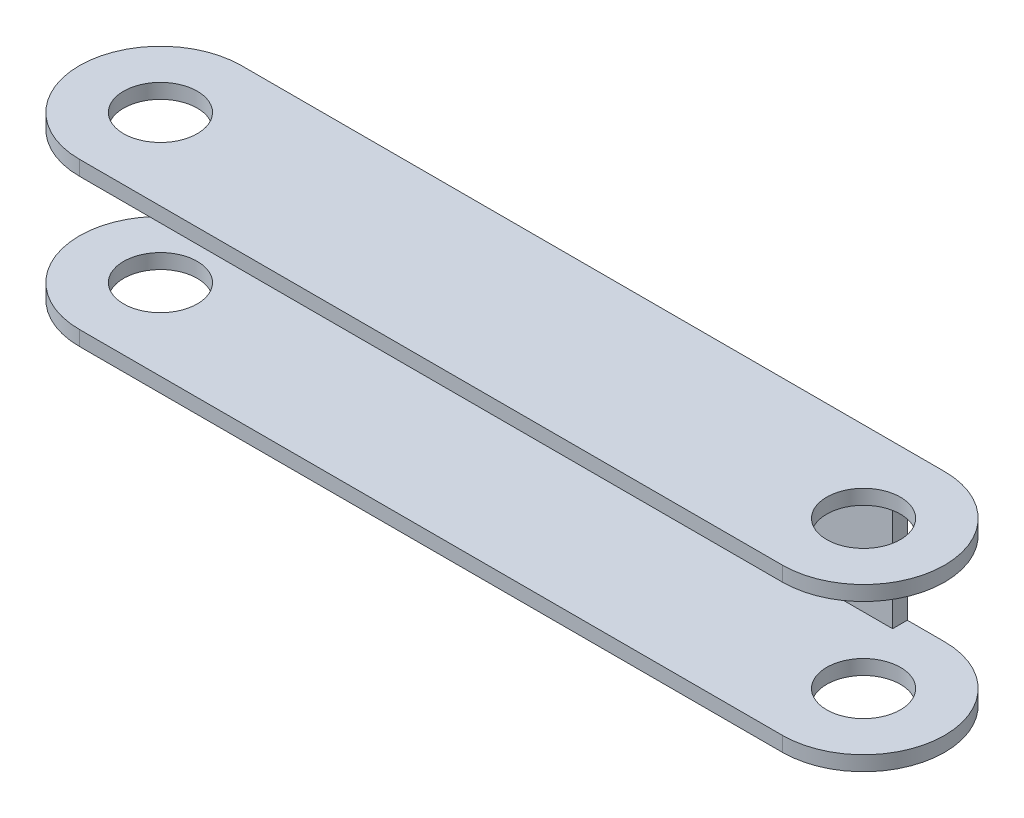
ISO-10303-21;
HEADER;
FILE_DESCRIPTION(('STEP AP214'),'2;1');
FILE_NAME('part.step','',(''),(''),'','','');
FILE_SCHEMA(('AUTOMOTIVE_DESIGN { 1 0 10303 214 1 1 1 1 }'));
ENDSEC;
DATA;
#1=APPLICATION_CONTEXT('core data for automotive mechanical design processes');
#2=APPLICATION_PROTOCOL_DEFINITION('international standard','automotive_design',2000,#1);
#3=PRODUCT_CONTEXT('',#1,'mechanical');
#4=PRODUCT('Part','Part','',(#3));
#5=PRODUCT_RELATED_PRODUCT_CATEGORY('part','',(#4));
#6=PRODUCT_DEFINITION_FORMATION('','',#4);
#7=PRODUCT_DEFINITION_CONTEXT('part definition',#1,'design');
#8=PRODUCT_DEFINITION('design','',#6,#7);
#9=PRODUCT_DEFINITION_SHAPE('','',#8);
#10=(LENGTH_UNIT() NAMED_UNIT(*) SI_UNIT(.MILLI.,.METRE.));
#11=(NAMED_UNIT(*) PLANE_ANGLE_UNIT() SI_UNIT($,.RADIAN.));
#12=(NAMED_UNIT(*) SI_UNIT($,.STERADIAN.) SOLID_ANGLE_UNIT());
#13=UNCERTAINTY_MEASURE_WITH_UNIT(LENGTH_MEASURE(1.E-05),#10,'distance_accuracy_value','');
#14=(GEOMETRIC_REPRESENTATION_CONTEXT(3) GLOBAL_UNCERTAINTY_ASSIGNED_CONTEXT((#13)) GLOBAL_UNIT_ASSIGNED_CONTEXT((#10,
#11,#12)) REPRESENTATION_CONTEXT('',''));
#15=CARTESIAN_POINT('',(0.,0.,0.));
#16=DIRECTION('',(0.,0.,1.));
#17=DIRECTION('',(1.,0.,0.));
#18=AXIS2_PLACEMENT_3D('',#15,#16,#17);
#19=CARTESIAN_POINT('',(-47.7,2.,0.));
#20=DIRECTION('',(0.,1.,0.));
#21=DIRECTION('',(0.,0.,1.));
#22=AXIS2_PLACEMENT_3D('',#19,#20,#21);
#23=PLANE('',#22);
#24=DIRECTION('',(0.,0.,1.));
#25=VECTOR('',#24,1.);
#26=CARTESIAN_POINT('',(-37.3590795102385,2.,-11.));
#27=LINE('',#26,#25);
#28=CARTESIAN_POINT('',(-37.3590795102385,2.,-11.));
#29=VERTEX_POINT('',#28);
#30=CARTESIAN_POINT('',(-37.3590795102385,2.,-9.00000000000001));
#31=VERTEX_POINT('',#30);
#32=EDGE_CURVE('E61',#29,#31,#27,.T.);
#33=ORIENTED_EDGE('',*,*,#32,.F.);
#34=DIRECTION('',(-1.,0.,0.));
#35=VECTOR('',#34,1.);
#36=CARTESIAN_POINT('',(-47.7,2.,-11.));
#37=LINE('',#36,#35);
#38=CARTESIAN_POINT('',(-47.7,2.,-11.));
#39=VERTEX_POINT('',#38);
#40=EDGE_CURVE('E230',#29,#39,#37,.T.);
#41=ORIENTED_EDGE('',*,*,#40,.T.);
#42=CARTESIAN_POINT('',(-47.7,2.,0.));
#43=DIRECTION('',(0.,1.,0.));
#44=DIRECTION('',(0.,0.,1.));
#45=AXIS2_PLACEMENT_3D('',#42,#43,#44);
#46=CIRCLE('',#45,11.);
#47=CARTESIAN_POINT('',(-47.7,2.,11.));
#48=VERTEX_POINT('',#47);
#49=EDGE_CURVE('E222',#39,#48,#46,.T.);
#50=ORIENTED_EDGE('',*,*,#49,.T.);
#51=DIRECTION('',(1.,0.,0.));
#52=VECTOR('',#51,1.);
#53=CARTESIAN_POINT('',(-47.7,2.,11.));
#54=LINE('',#53,#52);
#55=CARTESIAN_POINT('',(47.7,2.,11.));
#56=VERTEX_POINT('',#55);
#57=EDGE_CURVE('E225',#48,#56,#54,.T.);
#58=ORIENTED_EDGE('',*,*,#57,.T.);
#59=CARTESIAN_POINT('',(47.7,2.,0.));
#60=DIRECTION('',(0.,1.,0.));
#61=DIRECTION('',(0.,0.,1.));
#62=AXIS2_PLACEMENT_3D('',#59,#60,#61);
#63=CIRCLE('',#62,11.);
#64=CARTESIAN_POINT('',(47.7,2.,-11.));
#65=VERTEX_POINT('',#64);
#66=EDGE_CURVE('E228',#56,#65,#63,.T.);
#67=ORIENTED_EDGE('',*,*,#66,.T.);
#68=CARTESIAN_POINT('',(42.6409204897615,2.,-11.));
#69=VERTEX_POINT('',#68);
#70=EDGE_CURVE('E231',#65,#69,#37,.T.);
#71=ORIENTED_EDGE('',*,*,#70,.T.);
#72=DIRECTION('',(0.,0.,-1.));
#73=VECTOR('',#72,1.);
#74=CARTESIAN_POINT('',(42.6409204897615,2.,-11.));
#75=LINE('',#74,#73);
#76=CARTESIAN_POINT('',(42.6409204897615,2.,-9.00000000000001));
#77=VERTEX_POINT('',#76);
#78=EDGE_CURVE('E202',#77,#69,#75,.T.);
#79=ORIENTED_EDGE('',*,*,#78,.F.);
#80=DIRECTION('',(1.,0.,0.));
#81=VECTOR('',#80,1.);
#82=CARTESIAN_POINT('',(-37.3590795102385,2.,-9.00000000000001));
#83=LINE('',#82,#81);
#84=EDGE_CURVE('E56',#31,#77,#83,.T.);
#85=ORIENTED_EDGE('',*,*,#84,.F.);
#86=EDGE_LOOP('',(#33,#41,#50,#58,#67,#71,#79,#85));
#87=FACE_BOUND('',#86,.T.);
#88=CARTESIAN_POINT('',(47.7,2.,0.));
#89=DIRECTION('',(0.,1.,0.));
#90=DIRECTION('',(0.,0.,1.));
#91=AXIS2_PLACEMENT_3D('',#88,#89,#90);
#92=CIRCLE('',#91,5.);
#93=CARTESIAN_POINT('',(47.7,2.,4.99999999999999));
#94=VERTEX_POINT('',#93);
#95=EDGE_CURVE('E216',#94,#94,#92,.T.);
#96=ORIENTED_EDGE('',*,*,#95,.F.);
#97=EDGE_LOOP('',(#96));
#98=FACE_BOUND('',#97,.T.);
#99=CARTESIAN_POINT('',(-47.7,2.,0.));
#100=DIRECTION('',(0.,1.,0.));
#101=DIRECTION('',(0.,0.,1.));
#102=AXIS2_PLACEMENT_3D('',#99,#100,#101);
#103=CIRCLE('',#102,5.);
#104=CARTESIAN_POINT('',(-47.7,2.,5.00000000000002));
#105=VERTEX_POINT('',#104);
#106=EDGE_CURVE('E210',#105,#105,#103,.T.);
#107=ORIENTED_EDGE('',*,*,#106,.F.);
#108=EDGE_LOOP('',(#107));
#109=FACE_BOUND('',#108,.T.);
#110=ADVANCED_FACE('F41',(#87,#98,#109),#23,.T.);
#111=CARTESIAN_POINT('',(-47.7,0.,0.));
#112=DIRECTION('',(0.,1.,0.));
#113=DIRECTION('',(0.,0.,1.));
#114=AXIS2_PLACEMENT_3D('',#111,#112,#113);
#115=PLANE('',#114);
#116=CARTESIAN_POINT('',(-47.7,0.,0.));
#117=DIRECTION('',(0.,1.,0.));
#118=DIRECTION('',(0.,0.,1.));
#119=AXIS2_PLACEMENT_3D('',#116,#117,#118);
#120=CIRCLE('',#119,11.);
#121=CARTESIAN_POINT('',(-47.7,0.,-11.));
#122=VERTEX_POINT('',#121);
#123=CARTESIAN_POINT('',(-47.7,0.,11.));
#124=VERTEX_POINT('',#123);
#125=EDGE_CURVE('E219',#122,#124,#120,.T.);
#126=ORIENTED_EDGE('',*,*,#125,.F.);
#127=DIRECTION('',(-1.,0.,0.));
#128=VECTOR('',#127,1.);
#129=CARTESIAN_POINT('',(-47.7,0.,-11.));
#130=LINE('',#129,#128);
#131=CARTESIAN_POINT('',(47.7,0.,-11.));
#132=VERTEX_POINT('',#131);
#133=EDGE_CURVE('E226',#132,#122,#130,.T.);
#134=ORIENTED_EDGE('',*,*,#133,.F.);
#135=CARTESIAN_POINT('',(47.7,0.,0.));
#136=DIRECTION('',(0.,1.,0.));
#137=DIRECTION('',(0.,0.,1.));
#138=AXIS2_PLACEMENT_3D('',#135,#136,#137);
#139=CIRCLE('',#138,11.);
#140=CARTESIAN_POINT('',(47.7,0.,11.));
#141=VERTEX_POINT('',#140);
#142=EDGE_CURVE('E238',#141,#132,#139,.T.);
#143=ORIENTED_EDGE('',*,*,#142,.F.);
#144=DIRECTION('',(1.,0.,0.));
#145=VECTOR('',#144,1.);
#146=CARTESIAN_POINT('',(-47.7,0.,11.));
#147=LINE('',#146,#145);
#148=EDGE_CURVE('E236',#124,#141,#147,.T.);
#149=ORIENTED_EDGE('',*,*,#148,.F.);
#150=EDGE_LOOP('',(#126,#134,#143,#149));
#151=FACE_BOUND('',#150,.T.);
#152=CARTESIAN_POINT('',(47.7,0.,0.));
#153=DIRECTION('',(0.,1.,0.));
#154=DIRECTION('',(0.,0.,1.));
#155=AXIS2_PLACEMENT_3D('',#152,#153,#154);
#156=CIRCLE('',#155,5.);
#157=CARTESIAN_POINT('',(47.7,0.,4.99999999999999));
#158=VERTEX_POINT('',#157);
#159=EDGE_CURVE('E213',#158,#158,#156,.T.);
#160=ORIENTED_EDGE('',*,*,#159,.T.);
#161=EDGE_LOOP('',(#160));
#162=FACE_BOUND('',#161,.T.);
#163=CARTESIAN_POINT('',(-47.7,0.,0.));
#164=DIRECTION('',(0.,1.,0.));
#165=DIRECTION('',(0.,0.,1.));
#166=AXIS2_PLACEMENT_3D('',#163,#164,#165);
#167=CIRCLE('',#166,5.);
#168=CARTESIAN_POINT('',(-47.7,0.,5.00000000000002));
#169=VERTEX_POINT('',#168);
#170=EDGE_CURVE('E209',#169,#169,#167,.T.);
#171=ORIENTED_EDGE('',*,*,#170,.T.);
#172=EDGE_LOOP('',(#171));
#173=FACE_BOUND('',#172,.T.);
#174=ADVANCED_FACE('F256',(#151,#162,#173),#115,.F.);
#175=CARTESIAN_POINT('',(-47.7,2.,0.));
#176=DIRECTION('',(0.,-1.,0.));
#177=DIRECTION('',(0.,0.,-1.));
#178=AXIS2_PLACEMENT_3D('',#175,#176,#177);
#179=CYLINDRICAL_SURFACE('',#178,11.);
#180=ORIENTED_EDGE('',*,*,#125,.T.);
#181=DIRECTION('',(0.,-1.,0.));
#182=VECTOR('',#181,1.);
#183=CARTESIAN_POINT('',(-47.7,2.,11.));
#184=LINE('',#183,#182);
#185=EDGE_CURVE('E11',#48,#124,#184,.T.);
#186=ORIENTED_EDGE('',*,*,#185,.F.);
#187=ORIENTED_EDGE('',*,*,#49,.F.);
#188=DIRECTION('',(0.,-1.,0.));
#189=VECTOR('',#188,1.);
#190=CARTESIAN_POINT('',(-47.7,2.,-11.));
#191=LINE('',#190,#189);
#192=EDGE_CURVE('E233',#39,#122,#191,.T.);
#193=ORIENTED_EDGE('',*,*,#192,.T.);
#194=EDGE_LOOP('',(#180,#186,#187,#193));
#195=FACE_BOUND('',#194,.T.);
#196=ADVANCED_FACE('F43',(#195),#179,.T.);
#197=CARTESIAN_POINT('',(-47.7,2.,11.));
#198=DIRECTION('',(0.,0.,-1.));
#199=DIRECTION('',(-1.,0.,0.));
#200=AXIS2_PLACEMENT_3D('',#197,#198,#199);
#201=PLANE('',#200);
#202=ORIENTED_EDGE('',*,*,#148,.T.);
#203=DIRECTION('',(0.,-1.,0.));
#204=VECTOR('',#203,1.);
#205=CARTESIAN_POINT('',(47.7,2.,11.));
#206=LINE('',#205,#204);
#207=EDGE_CURVE('E49',#56,#141,#206,.T.);
#208=ORIENTED_EDGE('',*,*,#207,.F.);
#209=ORIENTED_EDGE('',*,*,#57,.F.);
#210=ORIENTED_EDGE('',*,*,#185,.T.);
#211=EDGE_LOOP('',(#202,#208,#209,#210));
#212=FACE_BOUND('',#211,.T.);
#213=ADVANCED_FACE('F292',(#212),#201,.F.);
#214=CARTESIAN_POINT('',(47.7,2.,0.));
#215=DIRECTION('',(0.,-1.,0.));
#216=DIRECTION('',(0.,0.,-1.));
#217=AXIS2_PLACEMENT_3D('',#214,#215,#216);
#218=CYLINDRICAL_SURFACE('',#217,11.);
#219=ORIENTED_EDGE('',*,*,#142,.T.);
#220=DIRECTION('',(0.,-1.,0.));
#221=VECTOR('',#220,1.);
#222=CARTESIAN_POINT('',(47.7,2.,-11.));
#223=LINE('',#222,#221);
#224=EDGE_CURVE('E243',#65,#132,#223,.T.);
#225=ORIENTED_EDGE('',*,*,#224,.F.);
#226=ORIENTED_EDGE('',*,*,#66,.F.);
#227=ORIENTED_EDGE('',*,*,#207,.T.);
#228=EDGE_LOOP('',(#219,#225,#226,#227));
#229=FACE_BOUND('',#228,.T.);
#230=ADVANCED_FACE('F250',(#229),#218,.T.);
#231=CARTESIAN_POINT('',(-47.7,2.,-11.));
#232=DIRECTION('',(0.,0.,1.));
#233=DIRECTION('',(1.,0.,0.));
#234=AXIS2_PLACEMENT_3D('',#231,#232,#233);
#235=PLANE('',#234);
#236=ORIENTED_EDGE('',*,*,#133,.T.);
#237=ORIENTED_EDGE('',*,*,#192,.F.);
#238=ORIENTED_EDGE('',*,*,#40,.F.);
#239=DIRECTION('',(0.,-1.,0.));
#240=VECTOR('',#239,1.);
#241=CARTESIAN_POINT('',(-37.3590795102385,11.,-11.));
#242=LINE('',#241,#240);
#243=CARTESIAN_POINT('',(-37.3590795102385,20.,-11.));
#244=VERTEX_POINT('',#243);
#245=EDGE_CURVE('E204',#244,#29,#242,.T.);
#246=ORIENTED_EDGE('',*,*,#245,.F.);
#247=DIRECTION('',(-1.,0.,0.));
#248=VECTOR('',#247,1.);
#249=CARTESIAN_POINT('',(-47.7,20.,-11.));
#250=LINE('',#249,#248);
#251=CARTESIAN_POINT('',(-47.7,20.,-11.));
#252=VERTEX_POINT('',#251);
#253=EDGE_CURVE('E179',#244,#252,#250,.T.);
#254=ORIENTED_EDGE('',*,*,#253,.T.);
#255=DIRECTION('',(0.,1.,0.));
#256=VECTOR('',#255,1.);
#257=CARTESIAN_POINT('',(-47.7,20.,-11.));
#258=LINE('',#257,#256);
#259=CARTESIAN_POINT('',(-47.7,22.,-11.));
#260=VERTEX_POINT('',#259);
#261=EDGE_CURVE('E182',#252,#260,#258,.T.);
#262=ORIENTED_EDGE('',*,*,#261,.T.);
#263=DIRECTION('',(-1.,0.,0.));
#264=VECTOR('',#263,1.);
#265=CARTESIAN_POINT('',(-47.7,22.,-11.));
#266=LINE('',#265,#264);
#267=CARTESIAN_POINT('',(47.7,22.,-11.));
#268=VERTEX_POINT('',#267);
#269=EDGE_CURVE('E173',#268,#260,#266,.T.);
#270=ORIENTED_EDGE('',*,*,#269,.F.);
#271=DIRECTION('',(0.,1.,0.));
#272=VECTOR('',#271,1.);
#273=CARTESIAN_POINT('',(47.7,20.,-11.));
#274=LINE('',#273,#272);
#275=CARTESIAN_POINT('',(47.7,20.,-11.));
#276=VERTEX_POINT('',#275);
#277=EDGE_CURVE('E194',#276,#268,#274,.T.);
#278=ORIENTED_EDGE('',*,*,#277,.F.);
#279=CARTESIAN_POINT('',(42.6409204897615,20.,-11.));
#280=VERTEX_POINT('',#279);
#281=EDGE_CURVE('E180',#276,#280,#250,.T.);
#282=ORIENTED_EDGE('',*,*,#281,.T.);
#283=DIRECTION('',(0.,-1.,0.));
#284=VECTOR('',#283,1.);
#285=CARTESIAN_POINT('',(42.6409204897615,11.,-11.));
#286=LINE('',#285,#284);
#287=EDGE_CURVE('E138',#280,#69,#286,.T.);
#288=ORIENTED_EDGE('',*,*,#287,.T.);
#289=ORIENTED_EDGE('',*,*,#70,.F.);
#290=ORIENTED_EDGE('',*,*,#224,.T.);
#291=EDGE_LOOP('',(#236,#237,#238,#246,#254,#262,#270,#278,#282,#288,#289,#290));
#292=FACE_BOUND('',#291,.T.);
#293=ADVANCED_FACE('F260',(#292),#235,.F.);
#294=CARTESIAN_POINT('',(47.7,2.,0.));
#295=DIRECTION('',(0.,-1.,0.));
#296=DIRECTION('',(0.,0.,-1.));
#297=AXIS2_PLACEMENT_3D('',#294,#295,#296);
#298=CYLINDRICAL_SURFACE('',#297,5.);
#299=ORIENTED_EDGE('',*,*,#95,.T.);
#300=EDGE_LOOP('',(#299));
#301=FACE_BOUND('',#300,.T.);
#302=ORIENTED_EDGE('',*,*,#159,.F.);
#303=EDGE_LOOP('',(#302));
#304=FACE_BOUND('',#303,.T.);
#305=ADVANCED_FACE('F278',(#301,#304),#298,.F.);
#306=CARTESIAN_POINT('',(-47.7,2.,0.));
#307=DIRECTION('',(0.,-1.,0.));
#308=DIRECTION('',(0.,0.,-1.));
#309=AXIS2_PLACEMENT_3D('',#306,#307,#308);
#310=CYLINDRICAL_SURFACE('',#309,5.);
#311=ORIENTED_EDGE('',*,*,#106,.T.);
#312=EDGE_LOOP('',(#311));
#313=FACE_BOUND('',#312,.T.);
#314=ORIENTED_EDGE('',*,*,#170,.F.);
#315=EDGE_LOOP('',(#314));
#316=FACE_BOUND('',#315,.T.);
#317=ADVANCED_FACE('F270',(#313,#316),#310,.F.);
#318=CARTESIAN_POINT('',(-37.3590795102385,11.,-11.));
#319=DIRECTION('',(1.,0.,0.));
#320=DIRECTION('',(0.,0.,-1.));
#321=AXIS2_PLACEMENT_3D('',#318,#319,#320);
#322=PLANE('',#321);
#323=ORIENTED_EDGE('',*,*,#32,.T.);
#324=DIRECTION('',(0.,-1.,0.));
#325=VECTOR('',#324,1.);
#326=CARTESIAN_POINT('',(-37.3590795102385,11.,-9.00000000000001));
#327=LINE('',#326,#325);
#328=CARTESIAN_POINT('',(-37.3590795102385,20.,-9.00000000000001));
#329=VERTEX_POINT('',#328);
#330=EDGE_CURVE('E137',#329,#31,#327,.T.);
#331=ORIENTED_EDGE('',*,*,#330,.F.);
#332=DIRECTION('',(0.,0.,1.));
#333=VECTOR('',#332,1.);
#334=CARTESIAN_POINT('',(-37.3590795102385,20.,-11.));
#335=LINE('',#334,#333);
#336=EDGE_CURVE('E153',#244,#329,#335,.T.);
#337=ORIENTED_EDGE('',*,*,#336,.F.);
#338=ORIENTED_EDGE('',*,*,#245,.T.);
#339=EDGE_LOOP('',(#323,#331,#337,#338));
#340=FACE_BOUND('',#339,.T.);
#341=ADVANCED_FACE('F268',(#340),#322,.F.);
#342=CARTESIAN_POINT('',(-37.3590795102385,11.,-9.00000000000001));
#343=DIRECTION('',(0.,0.,-1.));
#344=DIRECTION('',(-1.,0.,0.));
#345=AXIS2_PLACEMENT_3D('',#342,#343,#344);
#346=PLANE('',#345);
#347=ORIENTED_EDGE('',*,*,#84,.T.);
#348=DIRECTION('',(0.,-1.,0.));
#349=VECTOR('',#348,1.);
#350=CARTESIAN_POINT('',(42.6409204897615,11.,-9.00000000000001));
#351=LINE('',#350,#349);
#352=CARTESIAN_POINT('',(42.6409204897615,20.,-9.00000000000001));
#353=VERTEX_POINT('',#352);
#354=EDGE_CURVE('E129',#353,#77,#351,.T.);
#355=ORIENTED_EDGE('',*,*,#354,.F.);
#356=DIRECTION('',(1.,0.,0.));
#357=VECTOR('',#356,1.);
#358=CARTESIAN_POINT('',(-37.3590795102385,20.,-9.00000000000001));
#359=LINE('',#358,#357);
#360=EDGE_CURVE('E133',#329,#353,#359,.T.);
#361=ORIENTED_EDGE('',*,*,#360,.F.);
#362=ORIENTED_EDGE('',*,*,#330,.T.);
#363=EDGE_LOOP('',(#347,#355,#361,#362));
#364=FACE_BOUND('',#363,.T.);
#365=ADVANCED_FACE('F131',(#364),#346,.F.);
#366=CARTESIAN_POINT('',(42.6409204897615,11.,-11.));
#367=DIRECTION('',(-1.,0.,0.));
#368=DIRECTION('',(0.,0.,1.));
#369=AXIS2_PLACEMENT_3D('',#366,#367,#368);
#370=PLANE('',#369);
#371=ORIENTED_EDGE('',*,*,#78,.T.);
#372=ORIENTED_EDGE('',*,*,#287,.F.);
#373=DIRECTION('',(0.,0.,-1.));
#374=VECTOR('',#373,1.);
#375=CARTESIAN_POINT('',(42.6409204897615,20.,-11.));
#376=LINE('',#375,#374);
#377=EDGE_CURVE('E141',#353,#280,#376,.T.);
#378=ORIENTED_EDGE('',*,*,#377,.F.);
#379=ORIENTED_EDGE('',*,*,#354,.T.);
#380=EDGE_LOOP('',(#371,#372,#378,#379));
#381=FACE_BOUND('',#380,.T.);
#382=ADVANCED_FACE('F142',(#381),#370,.F.);
#383=CARTESIAN_POINT('',(-47.7,20.,0.));
#384=DIRECTION('',(0.,-1.,0.));
#385=DIRECTION('',(0.,0.,1.));
#386=AXIS2_PLACEMENT_3D('',#383,#384,#385);
#387=PLANE('',#386);
#388=ORIENTED_EDGE('',*,*,#336,.T.);
#389=ORIENTED_EDGE('',*,*,#360,.T.);
#390=ORIENTED_EDGE('',*,*,#377,.T.);
#391=ORIENTED_EDGE('',*,*,#281,.F.);
#392=CARTESIAN_POINT('',(47.7,20.,0.));
#393=DIRECTION('',(0.,1.,0.));
#394=DIRECTION('',(0.,0.,1.));
#395=AXIS2_PLACEMENT_3D('',#392,#393,#394);
#396=CIRCLE('',#395,11.);
#397=CARTESIAN_POINT('',(47.7,20.,11.));
#398=VERTEX_POINT('',#397);
#399=EDGE_CURVE('E176',#398,#276,#396,.T.);
#400=ORIENTED_EDGE('',*,*,#399,.F.);
#401=DIRECTION('',(1.,0.,0.));
#402=VECTOR('',#401,1.);
#403=CARTESIAN_POINT('',(-47.7,20.,11.));
#404=LINE('',#403,#402);
#405=CARTESIAN_POINT('',(-47.7,20.,11.));
#406=VERTEX_POINT('',#405);
#407=EDGE_CURVE('E172',#406,#398,#404,.T.);
#408=ORIENTED_EDGE('',*,*,#407,.F.);
#409=CARTESIAN_POINT('',(-47.7,20.,0.));
#410=DIRECTION('',(0.,1.,0.));
#411=DIRECTION('',(0.,0.,1.));
#412=AXIS2_PLACEMENT_3D('',#409,#410,#411);
#413=CIRCLE('',#412,11.);
#414=EDGE_CURVE('E169',#252,#406,#413,.T.);
#415=ORIENTED_EDGE('',*,*,#414,.F.);
#416=ORIENTED_EDGE('',*,*,#253,.F.);
#417=EDGE_LOOP('',(#388,#389,#390,#391,#400,#408,#415,#416));
#418=FACE_BOUND('',#417,.T.);
#419=CARTESIAN_POINT('',(47.7,20.,0.));
#420=DIRECTION('',(0.,1.,0.));
#421=DIRECTION('',(0.,0.,1.));
#422=AXIS2_PLACEMENT_3D('',#419,#420,#421);
#423=CIRCLE('',#422,5.);
#424=CARTESIAN_POINT('',(47.7,20.,4.99999999999999));
#425=VERTEX_POINT('',#424);
#426=EDGE_CURVE('E163',#425,#425,#423,.T.);
#427=ORIENTED_EDGE('',*,*,#426,.T.);
#428=EDGE_LOOP('',(#427));
#429=FACE_BOUND('',#428,.T.);
#430=CARTESIAN_POINT('',(-47.7,20.,0.));
#431=DIRECTION('',(0.,1.,0.));
#432=DIRECTION('',(0.,0.,1.));
#433=AXIS2_PLACEMENT_3D('',#430,#431,#432);
#434=CIRCLE('',#433,5.);
#435=CARTESIAN_POINT('',(-47.7,20.,5.00000000000002));
#436=VERTEX_POINT('',#435);
#437=EDGE_CURVE('E157',#436,#436,#434,.T.);
#438=ORIENTED_EDGE('',*,*,#437,.T.);
#439=EDGE_LOOP('',(#438));
#440=FACE_BOUND('',#439,.T.);
#441=ADVANCED_FACE('F149',(#418,#429,#440),#387,.T.);
#442=CARTESIAN_POINT('',(-47.7,22.,0.));
#443=DIRECTION('',(0.,-1.,0.));
#444=DIRECTION('',(0.,0.,1.));
#445=AXIS2_PLACEMENT_3D('',#442,#443,#444);
#446=PLANE('',#445);
#447=CARTESIAN_POINT('',(-47.7,22.,0.));
#448=DIRECTION('',(0.,1.,0.));
#449=DIRECTION('',(0.,0.,1.));
#450=AXIS2_PLACEMENT_3D('',#447,#448,#449);
#451=CIRCLE('',#450,11.);
#452=CARTESIAN_POINT('',(-47.7,22.,11.));
#453=VERTEX_POINT('',#452);
#454=EDGE_CURVE('E166',#260,#453,#451,.T.);
#455=ORIENTED_EDGE('',*,*,#454,.T.);
#456=DIRECTION('',(1.,0.,0.));
#457=VECTOR('',#456,1.);
#458=CARTESIAN_POINT('',(-47.7,22.,11.));
#459=LINE('',#458,#457);
#460=CARTESIAN_POINT('',(47.7,22.,11.));
#461=VERTEX_POINT('',#460);
#462=EDGE_CURVE('E185',#453,#461,#459,.T.);
#463=ORIENTED_EDGE('',*,*,#462,.T.);
#464=CARTESIAN_POINT('',(47.7,22.,0.));
#465=DIRECTION('',(0.,1.,0.));
#466=DIRECTION('',(0.,0.,1.));
#467=AXIS2_PLACEMENT_3D('',#464,#465,#466);
#468=CIRCLE('',#467,11.);
#469=EDGE_CURVE('E188',#461,#268,#468,.T.);
#470=ORIENTED_EDGE('',*,*,#469,.T.);
#471=ORIENTED_EDGE('',*,*,#269,.T.);
#472=EDGE_LOOP('',(#455,#463,#470,#471));
#473=FACE_BOUND('',#472,.T.);
#474=CARTESIAN_POINT('',(47.7,22.,0.));
#475=DIRECTION('',(0.,1.,0.));
#476=DIRECTION('',(0.,0.,1.));
#477=AXIS2_PLACEMENT_3D('',#474,#475,#476);
#478=CIRCLE('',#477,5.);
#479=CARTESIAN_POINT('',(47.7,22.,4.99999999999999));
#480=VERTEX_POINT('',#479);
#481=EDGE_CURVE('E160',#480,#480,#478,.T.);
#482=ORIENTED_EDGE('',*,*,#481,.F.);
#483=EDGE_LOOP('',(#482));
#484=FACE_BOUND('',#483,.T.);
#485=CARTESIAN_POINT('',(-47.7,22.,0.));
#486=DIRECTION('',(0.,1.,0.));
#487=DIRECTION('',(0.,0.,1.));
#488=AXIS2_PLACEMENT_3D('',#485,#486,#487);
#489=CIRCLE('',#488,5.);
#490=CARTESIAN_POINT('',(-47.7,22.,5.00000000000002));
#491=VERTEX_POINT('',#490);
#492=EDGE_CURVE('E147',#491,#491,#489,.T.);
#493=ORIENTED_EDGE('',*,*,#492,.F.);
#494=EDGE_LOOP('',(#493));
#495=FACE_BOUND('',#494,.T.);
#496=ADVANCED_FACE('F329',(#473,#484,#495),#446,.F.);
#497=CARTESIAN_POINT('',(-47.7,20.,0.));
#498=DIRECTION('',(0.,1.,0.));
#499=DIRECTION('',(0.,0.,-1.));
#500=AXIS2_PLACEMENT_3D('',#497,#498,#499);
#501=CYLINDRICAL_SURFACE('',#500,11.);
#502=ORIENTED_EDGE('',*,*,#454,.F.);
#503=ORIENTED_EDGE('',*,*,#261,.F.);
#504=ORIENTED_EDGE('',*,*,#414,.T.);
#505=DIRECTION('',(0.,1.,0.));
#506=VECTOR('',#505,1.);
#507=CARTESIAN_POINT('',(-47.7,20.,11.));
#508=LINE('',#507,#506);
#509=EDGE_CURVE('E198',#406,#453,#508,.T.);
#510=ORIENTED_EDGE('',*,*,#509,.T.);
#511=EDGE_LOOP('',(#502,#503,#504,#510));
#512=FACE_BOUND('',#511,.T.);
#513=ADVANCED_FACE('F338',(#512),#501,.T.);
#514=CARTESIAN_POINT('',(-47.7,20.,11.));
#515=DIRECTION('',(0.,0.,-1.));
#516=DIRECTION('',(-1.,0.,0.));
#517=AXIS2_PLACEMENT_3D('',#514,#515,#516);
#518=PLANE('',#517);
#519=ORIENTED_EDGE('',*,*,#462,.F.);
#520=ORIENTED_EDGE('',*,*,#509,.F.);
#521=ORIENTED_EDGE('',*,*,#407,.T.);
#522=DIRECTION('',(0.,1.,0.));
#523=VECTOR('',#522,1.);
#524=CARTESIAN_POINT('',(47.7,20.,11.));
#525=LINE('',#524,#523);
#526=EDGE_CURVE('E196',#398,#461,#525,.T.);
#527=ORIENTED_EDGE('',*,*,#526,.T.);
#528=EDGE_LOOP('',(#519,#520,#521,#527));
#529=FACE_BOUND('',#528,.T.);
#530=ADVANCED_FACE('F347',(#529),#518,.F.);
#531=CARTESIAN_POINT('',(47.7,20.,0.));
#532=DIRECTION('',(0.,1.,0.));
#533=DIRECTION('',(0.,0.,-1.));
#534=AXIS2_PLACEMENT_3D('',#531,#532,#533);
#535=CYLINDRICAL_SURFACE('',#534,11.);
#536=ORIENTED_EDGE('',*,*,#469,.F.);
#537=ORIENTED_EDGE('',*,*,#526,.F.);
#538=ORIENTED_EDGE('',*,*,#399,.T.);
#539=ORIENTED_EDGE('',*,*,#277,.T.);
#540=EDGE_LOOP('',(#536,#537,#538,#539));
#541=FACE_BOUND('',#540,.T.);
#542=ADVANCED_FACE('F356',(#541),#535,.T.);
#543=CARTESIAN_POINT('',(47.7,20.,0.));
#544=DIRECTION('',(0.,1.,0.));
#545=DIRECTION('',(0.,0.,-1.));
#546=AXIS2_PLACEMENT_3D('',#543,#544,#545);
#547=CYLINDRICAL_SURFACE('',#546,5.);
#548=ORIENTED_EDGE('',*,*,#426,.F.);
#549=EDGE_LOOP('',(#548));
#550=FACE_BOUND('',#549,.T.);
#551=ORIENTED_EDGE('',*,*,#481,.T.);
#552=EDGE_LOOP('',(#551));
#553=FACE_BOUND('',#552,.T.);
#554=ADVANCED_FACE('F365',(#550,#553),#547,.F.);
#555=CARTESIAN_POINT('',(-47.7,20.,0.));
#556=DIRECTION('',(0.,1.,0.));
#557=DIRECTION('',(0.,0.,-1.));
#558=AXIS2_PLACEMENT_3D('',#555,#556,#557);
#559=CYLINDRICAL_SURFACE('',#558,5.);
#560=ORIENTED_EDGE('',*,*,#437,.F.);
#561=EDGE_LOOP('',(#560));
#562=FACE_BOUND('',#561,.T.);
#563=ORIENTED_EDGE('',*,*,#492,.T.);
#564=EDGE_LOOP('',(#563));
#565=FACE_BOUND('',#564,.T.);
#566=ADVANCED_FACE('F374',(#562,#565),#559,.F.);
#567=CLOSED_SHELL('',(#110,#174,#196,#213,#230,#293,#305,#317,#341,#365,#382,#441,#496,#513,
#530,#542,#554,#566));
#568=MANIFOLD_SOLID_BREP('B2',#567);
#569=ADVANCED_BREP_SHAPE_REPRESENTATION('',(#18,#568),#14);
#570=SHAPE_DEFINITION_REPRESENTATION(#9,#569);
ENDSEC;
END-ISO-10303-21;
